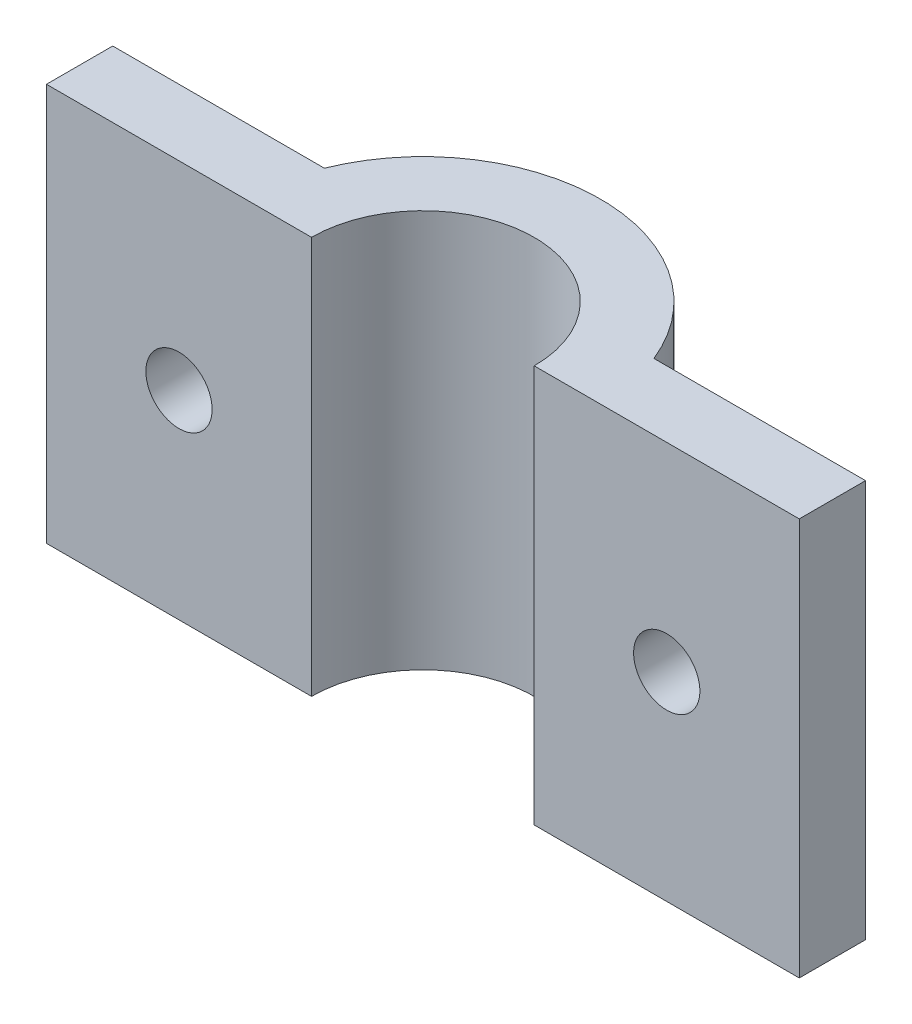
ISO-10303-21;
HEADER;
FILE_DESCRIPTION(('STEP AP214'),'2;1');
FILE_NAME('part.step','',(''),(''),'','','');
FILE_SCHEMA(('AUTOMOTIVE_DESIGN { 1 0 10303 214 1 1 1 1 }'));
ENDSEC;
DATA;
#1=APPLICATION_CONTEXT('core data for automotive mechanical design processes');
#2=APPLICATION_PROTOCOL_DEFINITION('international standard','automotive_design',2000,#1);
#3=PRODUCT_CONTEXT('',#1,'mechanical');
#4=PRODUCT('Part','Part','',(#3));
#5=PRODUCT_RELATED_PRODUCT_CATEGORY('part','',(#4));
#6=PRODUCT_DEFINITION_FORMATION('','',#4);
#7=PRODUCT_DEFINITION_CONTEXT('part definition',#1,'design');
#8=PRODUCT_DEFINITION('design','',#6,#7);
#9=PRODUCT_DEFINITION_SHAPE('','',#8);
#10=(LENGTH_UNIT() NAMED_UNIT(*) SI_UNIT(.MILLI.,.METRE.));
#11=(NAMED_UNIT(*) PLANE_ANGLE_UNIT() SI_UNIT($,.RADIAN.));
#12=(NAMED_UNIT(*) SI_UNIT($,.STERADIAN.) SOLID_ANGLE_UNIT());
#13=UNCERTAINTY_MEASURE_WITH_UNIT(LENGTH_MEASURE(1.E-05),#10,'distance_accuracy_value','');
#14=(GEOMETRIC_REPRESENTATION_CONTEXT(3) GLOBAL_UNCERTAINTY_ASSIGNED_CONTEXT((#13)) GLOBAL_UNIT_ASSIGNED_CONTEXT((#10,
#11,#12)) REPRESENTATION_CONTEXT('',''));
#15=CARTESIAN_POINT('',(0.,0.,0.));
#16=DIRECTION('',(0.,0.,1.));
#17=DIRECTION('',(1.,0.,0.));
#18=AXIS2_PLACEMENT_3D('',#15,#16,#17);
#19=CARTESIAN_POINT('',(10.668,38.1,0.));
#20=DIRECTION('',(0.,-1.,0.));
#21=DIRECTION('',(0.,0.,-1.));
#22=AXIS2_PLACEMENT_3D('',#19,#20,#21);
#23=CYLINDRICAL_SURFACE('',#22,10.668);
#24=CARTESIAN_POINT('',(10.668,0.,0.));
#25=DIRECTION('',(0.,-1.,0.));
#26=DIRECTION('',(0.,0.,-1.));
#27=AXIS2_PLACEMENT_3D('',#24,#25,#26);
#28=CIRCLE('',#27,10.668);
#29=CARTESIAN_POINT('',(0.,0.,0.));
#30=VERTEX_POINT('',#29);
#31=CARTESIAN_POINT('',(21.336,0.,0.));
#32=VERTEX_POINT('',#31);
#33=EDGE_CURVE('E143',#30,#32,#28,.T.);
#34=ORIENTED_EDGE('',*,*,#33,.T.);
#35=DIRECTION('',(0.,-1.,0.));
#36=VECTOR('',#35,1.);
#37=CARTESIAN_POINT('',(21.336,38.1,0.));
#38=LINE('',#37,#36);
#39=CARTESIAN_POINT('',(21.336,38.1,0.));
#40=VERTEX_POINT('',#39);
#41=EDGE_CURVE('E11',#40,#32,#38,.T.);
#42=ORIENTED_EDGE('',*,*,#41,.F.);
#43=CARTESIAN_POINT('',(10.668,38.1,0.));
#44=DIRECTION('',(0.,-1.,0.));
#45=DIRECTION('',(0.,0.,-1.));
#46=AXIS2_PLACEMENT_3D('',#43,#44,#45);
#47=CIRCLE('',#46,10.668);
#48=CARTESIAN_POINT('',(0.,38.1,0.));
#49=VERTEX_POINT('',#48);
#50=EDGE_CURVE('E165',#49,#40,#47,.T.);
#51=ORIENTED_EDGE('',*,*,#50,.F.);
#52=DIRECTION('',(0.,-1.,0.));
#53=VECTOR('',#52,1.);
#54=CARTESIAN_POINT('',(0.,38.1,0.));
#55=LINE('',#54,#53);
#56=EDGE_CURVE('E139',#49,#30,#55,.T.);
#57=ORIENTED_EDGE('',*,*,#56,.T.);
#58=EDGE_LOOP('',(#34,#42,#51,#57));
#59=FACE_BOUND('',#58,.T.);
#60=ADVANCED_FACE('F41',(#59),#23,.F.);
#61=CARTESIAN_POINT('',(21.336,38.1,0.));
#62=DIRECTION('',(0.,0.,-1.));
#63=DIRECTION('',(-1.,0.,0.));
#64=AXIS2_PLACEMENT_3D('',#61,#62,#63);
#65=PLANE('',#64);
#66=CARTESIAN_POINT('',(34.036,19.05,0.));
#67=DIRECTION('',(0.,0.,-1.));
#68=DIRECTION('',(-1.,0.,0.));
#69=AXIS2_PLACEMENT_3D('',#66,#67,#68);
#70=CIRCLE('',#69,3.175);
#71=CARTESIAN_POINT('',(30.861,19.05,0.));
#72=VERTEX_POINT('',#71);
#73=EDGE_CURVE('E214',#72,#72,#70,.T.);
#74=ORIENTED_EDGE('',*,*,#73,.T.);
#75=EDGE_LOOP('',(#74));
#76=FACE_BOUND('',#75,.T.);
#77=DIRECTION('',(1.,0.,0.));
#78=VECTOR('',#77,1.);
#79=CARTESIAN_POINT('',(21.336,0.,0.));
#80=LINE('',#79,#78);
#81=CARTESIAN_POINT('',(46.736,0.,0.));
#82=VERTEX_POINT('',#81);
#83=EDGE_CURVE('E147',#32,#82,#80,.T.);
#84=ORIENTED_EDGE('',*,*,#83,.T.);
#85=DIRECTION('',(0.,-1.,0.));
#86=VECTOR('',#85,1.);
#87=CARTESIAN_POINT('',(46.736,38.1,0.));
#88=LINE('',#87,#86);
#89=CARTESIAN_POINT('',(46.736,38.1,0.));
#90=VERTEX_POINT('',#89);
#91=EDGE_CURVE('E51',#90,#82,#88,.T.);
#92=ORIENTED_EDGE('',*,*,#91,.F.);
#93=DIRECTION('',(1.,0.,0.));
#94=VECTOR('',#93,1.);
#95=CARTESIAN_POINT('',(21.336,38.1,0.));
#96=LINE('',#95,#94);
#97=EDGE_CURVE('E102',#40,#90,#96,.T.);
#98=ORIENTED_EDGE('',*,*,#97,.F.);
#99=ORIENTED_EDGE('',*,*,#41,.T.);
#100=EDGE_LOOP('',(#84,#92,#98,#99));
#101=FACE_BOUND('',#100,.T.);
#102=ADVANCED_FACE('F223',(#76,#101),#65,.F.);
#103=CARTESIAN_POINT('',(46.736,38.1,-6.35));
#104=DIRECTION('',(-1.,0.,0.));
#105=DIRECTION('',(0.,0.,1.));
#106=AXIS2_PLACEMENT_3D('',#103,#104,#105);
#107=PLANE('',#106);
#108=DIRECTION('',(0.,0.,-1.));
#109=VECTOR('',#108,1.);
#110=CARTESIAN_POINT('',(46.736,0.,-6.35));
#111=LINE('',#110,#109);
#112=CARTESIAN_POINT('',(46.736,0.,-6.35));
#113=VERTEX_POINT('',#112);
#114=EDGE_CURVE('E150',#82,#113,#111,.T.);
#115=ORIENTED_EDGE('',*,*,#114,.T.);
#116=DIRECTION('',(0.,-1.,0.));
#117=VECTOR('',#116,1.);
#118=CARTESIAN_POINT('',(46.736,38.1,-6.35));
#119=LINE('',#118,#117);
#120=CARTESIAN_POINT('',(46.736,38.1,-6.35));
#121=VERTEX_POINT('',#120);
#122=EDGE_CURVE('E176',#121,#113,#119,.T.);
#123=ORIENTED_EDGE('',*,*,#122,.F.);
#124=DIRECTION('',(0.,0.,-1.));
#125=VECTOR('',#124,1.);
#126=CARTESIAN_POINT('',(46.736,38.1,-6.35));
#127=LINE('',#126,#125);
#128=EDGE_CURVE('E187',#90,#121,#127,.T.);
#129=ORIENTED_EDGE('',*,*,#128,.F.);
#130=ORIENTED_EDGE('',*,*,#91,.T.);
#131=EDGE_LOOP('',(#115,#123,#129,#130));
#132=FACE_BOUND('',#131,.T.);
#133=ADVANCED_FACE('F185',(#132),#107,.F.);
#134=CARTESIAN_POINT('',(26.4569145922068,38.1,-6.35));
#135=DIRECTION('',(0.,0.,1.));
#136=DIRECTION('',(1.,0.,0.));
#137=AXIS2_PLACEMENT_3D('',#134,#135,#136);
#138=PLANE('',#137);
#139=CARTESIAN_POINT('',(34.036,19.05,-6.35));
#140=DIRECTION('',(0.,0.,-1.));
#141=DIRECTION('',(-1.,0.,0.));
#142=AXIS2_PLACEMENT_3D('',#139,#140,#141);
#143=CIRCLE('',#142,3.175);
#144=CARTESIAN_POINT('',(30.861,19.05,-6.35));
#145=VERTEX_POINT('',#144);
#146=EDGE_CURVE('E215',#145,#145,#143,.T.);
#147=ORIENTED_EDGE('',*,*,#146,.F.);
#148=EDGE_LOOP('',(#147));
#149=FACE_BOUND('',#148,.T.);
#150=DIRECTION('',(-1.,0.,0.));
#151=VECTOR('',#150,1.);
#152=CARTESIAN_POINT('',(26.4569145922068,0.,-6.35));
#153=LINE('',#152,#151);
#154=CARTESIAN_POINT('',(26.4569145922068,0.,-6.35));
#155=VERTEX_POINT('',#154);
#156=EDGE_CURVE('E153',#113,#155,#153,.T.);
#157=ORIENTED_EDGE('',*,*,#156,.T.);
#158=DIRECTION('',(0.,-1.,0.));
#159=VECTOR('',#158,1.);
#160=CARTESIAN_POINT('',(26.4569145922068,38.1,-6.35));
#161=LINE('',#160,#159);
#162=CARTESIAN_POINT('',(26.4569145922068,38.1,-6.35));
#163=VERTEX_POINT('',#162);
#164=EDGE_CURVE('E172',#163,#155,#161,.T.);
#165=ORIENTED_EDGE('',*,*,#164,.F.);
#166=DIRECTION('',(-1.,0.,0.));
#167=VECTOR('',#166,1.);
#168=CARTESIAN_POINT('',(26.4569145922068,38.1,-6.35));
#169=LINE('',#168,#167);
#170=EDGE_CURVE('E200',#121,#163,#169,.T.);
#171=ORIENTED_EDGE('',*,*,#170,.F.);
#172=ORIENTED_EDGE('',*,*,#122,.T.);
#173=EDGE_LOOP('',(#157,#165,#171,#172));
#174=FACE_BOUND('',#173,.T.);
#175=ADVANCED_FACE('F195',(#149,#174),#138,.F.);
#176=CARTESIAN_POINT('',(10.668,38.1,0.));
#177=DIRECTION('',(0.,-1.,0.));
#178=DIRECTION('',(0.,0.,-1.));
#179=AXIS2_PLACEMENT_3D('',#176,#177,#178);
#180=CYLINDRICAL_SURFACE('',#179,17.018);
#181=CARTESIAN_POINT('',(10.668,0.,0.));
#182=DIRECTION('',(0.,1.,0.));
#183=DIRECTION('',(0.,0.,-1.));
#184=AXIS2_PLACEMENT_3D('',#181,#182,#183);
#185=CIRCLE('',#184,17.018);
#186=CARTESIAN_POINT('',(-5.12091459220677,0.,-6.35));
#187=VERTEX_POINT('',#186);
#188=EDGE_CURVE('E156',#155,#187,#185,.T.);
#189=ORIENTED_EDGE('',*,*,#188,.T.);
#190=DIRECTION('',(0.,-1.,0.));
#191=VECTOR('',#190,1.);
#192=CARTESIAN_POINT('',(-5.12091459220677,38.1,-6.35));
#193=LINE('',#192,#191);
#194=CARTESIAN_POINT('',(-5.12091459220677,38.1,-6.35));
#195=VERTEX_POINT('',#194);
#196=EDGE_CURVE('E132',#195,#187,#193,.T.);
#197=ORIENTED_EDGE('',*,*,#196,.F.);
#198=CARTESIAN_POINT('',(10.668,38.1,0.));
#199=DIRECTION('',(0.,1.,0.));
#200=DIRECTION('',(0.,0.,-1.));
#201=AXIS2_PLACEMENT_3D('',#198,#199,#200);
#202=CIRCLE('',#201,17.018);
#203=EDGE_CURVE('E121',#163,#195,#202,.T.);
#204=ORIENTED_EDGE('',*,*,#203,.F.);
#205=ORIENTED_EDGE('',*,*,#164,.T.);
#206=EDGE_LOOP('',(#189,#197,#204,#205));
#207=FACE_BOUND('',#206,.T.);
#208=ADVANCED_FACE('F198',(#207),#180,.T.);
#209=CARTESIAN_POINT('',(-5.12091459220677,38.1,-6.35));
#210=DIRECTION('',(0.,0.,1.));
#211=DIRECTION('',(1.,0.,0.));
#212=AXIS2_PLACEMENT_3D('',#209,#210,#211);
#213=PLANE('',#212);
#214=CARTESIAN_POINT('',(-12.7,19.05,-6.35));
#215=DIRECTION('',(0.,0.,-1.));
#216=DIRECTION('',(-1.,0.,0.));
#217=AXIS2_PLACEMENT_3D('',#214,#215,#216);
#218=CIRCLE('',#217,3.175);
#219=CARTESIAN_POINT('',(-15.875,19.05,-6.35));
#220=VERTEX_POINT('',#219);
#221=EDGE_CURVE('E210',#220,#220,#218,.T.);
#222=ORIENTED_EDGE('',*,*,#221,.F.);
#223=EDGE_LOOP('',(#222));
#224=FACE_BOUND('',#223,.T.);
#225=DIRECTION('',(-1.,0.,0.));
#226=VECTOR('',#225,1.);
#227=CARTESIAN_POINT('',(-5.12091459220677,0.,-6.35));
#228=LINE('',#227,#226);
#229=CARTESIAN_POINT('',(-25.4,0.,-6.35));
#230=VERTEX_POINT('',#229);
#231=EDGE_CURVE('E130',#187,#230,#228,.T.);
#232=ORIENTED_EDGE('',*,*,#231,.T.);
#233=DIRECTION('',(0.,-1.,0.));
#234=VECTOR('',#233,1.);
#235=CARTESIAN_POINT('',(-25.4,38.1,-6.35));
#236=LINE('',#235,#234);
#237=CARTESIAN_POINT('',(-25.4,38.1,-6.35));
#238=VERTEX_POINT('',#237);
#239=EDGE_CURVE('E127',#238,#230,#236,.T.);
#240=ORIENTED_EDGE('',*,*,#239,.F.);
#241=DIRECTION('',(-1.,0.,0.));
#242=VECTOR('',#241,1.);
#243=CARTESIAN_POINT('',(-5.12091459220677,38.1,-6.35));
#244=LINE('',#243,#242);
#245=EDGE_CURVE('E115',#195,#238,#244,.T.);
#246=ORIENTED_EDGE('',*,*,#245,.F.);
#247=ORIENTED_EDGE('',*,*,#196,.T.);
#248=EDGE_LOOP('',(#232,#240,#246,#247));
#249=FACE_BOUND('',#248,.T.);
#250=ADVANCED_FACE('F128',(#224,#249),#213,.F.);
#251=CARTESIAN_POINT('',(-25.4,38.1,-6.35));
#252=DIRECTION('',(1.,0.,0.));
#253=DIRECTION('',(0.,0.,-1.));
#254=AXIS2_PLACEMENT_3D('',#251,#252,#253);
#255=PLANE('',#254);
#256=DIRECTION('',(0.,0.,1.));
#257=VECTOR('',#256,1.);
#258=CARTESIAN_POINT('',(-25.4,0.,-6.35));
#259=LINE('',#258,#257);
#260=CARTESIAN_POINT('',(-25.4,0.,0.));
#261=VERTEX_POINT('',#260);
#262=EDGE_CURVE('E88',#230,#261,#259,.T.);
#263=ORIENTED_EDGE('',*,*,#262,.T.);
#264=DIRECTION('',(0.,-1.,0.));
#265=VECTOR('',#264,1.);
#266=CARTESIAN_POINT('',(-25.4,38.1,0.));
#267=LINE('',#266,#265);
#268=CARTESIAN_POINT('',(-25.4,38.1,0.));
#269=VERTEX_POINT('',#268);
#270=EDGE_CURVE('E133',#269,#261,#267,.T.);
#271=ORIENTED_EDGE('',*,*,#270,.F.);
#272=DIRECTION('',(0.,0.,1.));
#273=VECTOR('',#272,1.);
#274=CARTESIAN_POINT('',(-25.4,38.1,-6.35));
#275=LINE('',#274,#273);
#276=EDGE_CURVE('E119',#238,#269,#275,.T.);
#277=ORIENTED_EDGE('',*,*,#276,.F.);
#278=ORIENTED_EDGE('',*,*,#239,.T.);
#279=EDGE_LOOP('',(#263,#271,#277,#278));
#280=FACE_BOUND('',#279,.T.);
#281=ADVANCED_FACE('F135',(#280),#255,.F.);
#282=CARTESIAN_POINT('',(0.,38.1,0.));
#283=DIRECTION('',(0.,0.,-1.));
#284=DIRECTION('',(-1.,0.,0.));
#285=AXIS2_PLACEMENT_3D('',#282,#283,#284);
#286=PLANE('',#285);
#287=CARTESIAN_POINT('',(-12.7,19.05,0.));
#288=DIRECTION('',(0.,0.,-1.));
#289=DIRECTION('',(-1.,0.,0.));
#290=AXIS2_PLACEMENT_3D('',#287,#288,#289);
#291=CIRCLE('',#290,3.175);
#292=CARTESIAN_POINT('',(-15.875,19.05,0.));
#293=VERTEX_POINT('',#292);
#294=EDGE_CURVE('E44',#293,#293,#291,.T.);
#295=ORIENTED_EDGE('',*,*,#294,.T.);
#296=EDGE_LOOP('',(#295));
#297=FACE_BOUND('',#296,.T.);
#298=DIRECTION('',(1.,0.,0.));
#299=VECTOR('',#298,1.);
#300=CARTESIAN_POINT('',(0.,0.,0.));
#301=LINE('',#300,#299);
#302=EDGE_CURVE('E94',#261,#30,#301,.T.);
#303=ORIENTED_EDGE('',*,*,#302,.T.);
#304=ORIENTED_EDGE('',*,*,#56,.F.);
#305=DIRECTION('',(1.,0.,0.));
#306=VECTOR('',#305,1.);
#307=CARTESIAN_POINT('',(0.,38.1,0.));
#308=LINE('',#307,#306);
#309=EDGE_CURVE('E59',#269,#49,#308,.T.);
#310=ORIENTED_EDGE('',*,*,#309,.F.);
#311=ORIENTED_EDGE('',*,*,#270,.T.);
#312=EDGE_LOOP('',(#303,#304,#310,#311));
#313=FACE_BOUND('',#312,.T.);
#314=ADVANCED_FACE('F247',(#297,#313),#286,.F.);
#315=CARTESIAN_POINT('',(10.668,38.1,0.));
#316=DIRECTION('',(0.,-1.,0.));
#317=DIRECTION('',(0.,0.,-1.));
#318=AXIS2_PLACEMENT_3D('',#315,#316,#317);
#319=PLANE('',#318);
#320=ORIENTED_EDGE('',*,*,#50,.T.);
#321=ORIENTED_EDGE('',*,*,#97,.T.);
#322=ORIENTED_EDGE('',*,*,#128,.T.);
#323=ORIENTED_EDGE('',*,*,#170,.T.);
#324=ORIENTED_EDGE('',*,*,#203,.T.);
#325=ORIENTED_EDGE('',*,*,#245,.T.);
#326=ORIENTED_EDGE('',*,*,#276,.T.);
#327=ORIENTED_EDGE('',*,*,#309,.T.);
#328=EDGE_LOOP('',(#320,#321,#322,#323,#324,#325,#326,#327));
#329=FACE_BOUND('',#328,.T.);
#330=ADVANCED_FACE('F117',(#329),#319,.F.);
#331=CARTESIAN_POINT('',(10.668,0.,0.));
#332=DIRECTION('',(0.,-1.,0.));
#333=DIRECTION('',(0.,0.,-1.));
#334=AXIS2_PLACEMENT_3D('',#331,#332,#333);
#335=PLANE('',#334);
#336=ORIENTED_EDGE('',*,*,#33,.F.);
#337=ORIENTED_EDGE('',*,*,#302,.F.);
#338=ORIENTED_EDGE('',*,*,#262,.F.);
#339=ORIENTED_EDGE('',*,*,#231,.F.);
#340=ORIENTED_EDGE('',*,*,#188,.F.);
#341=ORIENTED_EDGE('',*,*,#156,.F.);
#342=ORIENTED_EDGE('',*,*,#114,.F.);
#343=ORIENTED_EDGE('',*,*,#83,.F.);
#344=EDGE_LOOP('',(#336,#337,#338,#339,#340,#341,#342,#343));
#345=FACE_BOUND('',#344,.T.);
#346=ADVANCED_FACE('F191',(#345),#335,.T.);
#347=CARTESIAN_POINT('',(-12.7,19.05,31.75));
#348=DIRECTION('',(0.,0.,-1.));
#349=DIRECTION('',(-1.,0.,0.));
#350=AXIS2_PLACEMENT_3D('',#347,#348,#349);
#351=CYLINDRICAL_SURFACE('',#350,3.175);
#352=CARTESIAN_POINT('',(-15.875,19.05,-6.35));
#353=CARTESIAN_POINT('',(-15.875,19.05,-6.28385416666667));
#354=CARTESIAN_POINT('',(-15.875,19.05,-6.21770833333333));
#355=CARTESIAN_POINT('',(-15.875,19.05,-6.08541666666667));
#356=CARTESIAN_POINT('',(-15.875,19.05,-6.01927083333334));
#357=CARTESIAN_POINT('',(-15.875,19.05,-5.88697916666667));
#358=CARTESIAN_POINT('',(-15.875,19.05,-5.82083333333333));
#359=CARTESIAN_POINT('',(-15.875,19.05,-5.68854166666667));
#360=CARTESIAN_POINT('',(-15.875,19.05,-5.62239583333333));
#361=CARTESIAN_POINT('',(-15.875,19.05,-5.49010416666667));
#362=CARTESIAN_POINT('',(-15.875,19.05,-5.42395833333333));
#363=CARTESIAN_POINT('',(-15.875,19.05,-5.29166666666667));
#364=CARTESIAN_POINT('',(-15.875,19.05,-5.22552083333333));
#365=CARTESIAN_POINT('',(-15.875,19.05,-5.09322916666667));
#366=CARTESIAN_POINT('',(-15.875,19.05,-5.02708333333333));
#367=CARTESIAN_POINT('',(-15.875,19.05,-4.89479166666666));
#368=CARTESIAN_POINT('',(-15.875,19.05,-4.82864583333333));
#369=CARTESIAN_POINT('',(-15.875,19.05,-4.69635416666666));
#370=CARTESIAN_POINT('',(-15.875,19.05,-4.63020833333333));
#371=CARTESIAN_POINT('',(-15.875,19.05,-4.49791666666667));
#372=CARTESIAN_POINT('',(-15.875,19.05,-4.43177083333333));
#373=CARTESIAN_POINT('',(-15.875,19.05,-4.29947916666666));
#374=CARTESIAN_POINT('',(-15.875,19.05,-4.23333333333333));
#375=CARTESIAN_POINT('',(-15.875,19.05,-4.10104166666666));
#376=CARTESIAN_POINT('',(-15.875,19.05,-4.03489583333333));
#377=CARTESIAN_POINT('',(-15.875,19.05,-3.90260416666667));
#378=CARTESIAN_POINT('',(-15.875,19.05,-3.83645833333333));
#379=CARTESIAN_POINT('',(-15.875,19.05,-3.70416666666666));
#380=CARTESIAN_POINT('',(-15.875,19.05,-3.63802083333333));
#381=CARTESIAN_POINT('',(-15.875,19.05,-3.50572916666666));
#382=CARTESIAN_POINT('',(-15.875,19.05,-3.43958333333333));
#383=CARTESIAN_POINT('',(-15.875,19.05,-3.30729166666667));
#384=CARTESIAN_POINT('',(-15.875,19.05,-3.24114583333333));
#385=CARTESIAN_POINT('',(-15.875,19.05,-3.10885416666666));
#386=CARTESIAN_POINT('',(-15.875,19.05,-3.04270833333333));
#387=CARTESIAN_POINT('',(-15.875,19.05,-2.91041666666666));
#388=CARTESIAN_POINT('',(-15.875,19.05,-2.84427083333333));
#389=CARTESIAN_POINT('',(-15.875,19.05,-2.71197916666667));
#390=CARTESIAN_POINT('',(-15.875,19.05,-2.64583333333333));
#391=CARTESIAN_POINT('',(-15.875,19.05,-2.51354166666666));
#392=CARTESIAN_POINT('',(-15.875,19.05,-2.44739583333333));
#393=CARTESIAN_POINT('',(-15.875,19.05,-2.31510416666666));
#394=CARTESIAN_POINT('',(-15.875,19.05,-2.24895833333333));
#395=CARTESIAN_POINT('',(-15.875,19.05,-2.11666666666666));
#396=CARTESIAN_POINT('',(-15.875,19.05,-2.05052083333333));
#397=CARTESIAN_POINT('',(-15.875,19.05,-1.91822916666666));
#398=CARTESIAN_POINT('',(-15.875,19.05,-1.85208333333333));
#399=CARTESIAN_POINT('',(-15.875,19.05,-1.71979166666666));
#400=CARTESIAN_POINT('',(-15.875,19.05,-1.65364583333333));
#401=CARTESIAN_POINT('',(-15.875,19.05,-1.52135416666666));
#402=CARTESIAN_POINT('',(-15.875,19.05,-1.45520833333333));
#403=CARTESIAN_POINT('',(-15.875,19.05,-1.32291666666666));
#404=CARTESIAN_POINT('',(-15.875,19.05,-1.25677083333333));
#405=CARTESIAN_POINT('',(-15.875,19.05,-1.12447916666666));
#406=CARTESIAN_POINT('',(-15.875,19.05,-1.05833333333333));
#407=CARTESIAN_POINT('',(-15.875,19.05,-0.926041666666664));
#408=CARTESIAN_POINT('',(-15.875,19.05,-0.85989583333333));
#409=CARTESIAN_POINT('',(-15.875,19.05,-0.727604166666662));
#410=CARTESIAN_POINT('',(-15.875,19.05,-0.661458333333328));
#411=CARTESIAN_POINT('',(-15.875,19.05,-0.529166666666659));
#412=CARTESIAN_POINT('',(-15.875,19.05,-0.463020833333325));
#413=CARTESIAN_POINT('',(-15.875,19.05,-0.330729166666659));
#414=CARTESIAN_POINT('',(-15.875,19.05,-0.264583333333327));
#415=CARTESIAN_POINT('',(-15.875,19.05,-0.132291666666661));
#416=CARTESIAN_POINT('',(-15.875,19.05,-0.0661458333333272));
#417=CARTESIAN_POINT('',(-15.875,19.05,0.));
#418=B_SPLINE_CURVE_WITH_KNOTS('',3,(#352,#353,#354,#355,#356,#357,#358,#359,#360,#361,#362,
#363,#364,#365,#366,#367,#368,#369,#370,#371,#372,#373,#374,#375,#376,#377,#378,#379,#380,#381,
#382,#383,#384,#385,#386,#387,#388,#389,#390,#391,#392,#393,#394,#395,#396,#397,#398,#399,#400,
#401,#402,#403,#404,#405,#406,#407,#408,#409,#410,#411,#412,#413,#414,#415,#416,#417),
.UNSPECIFIED.,.F.,.F.,(4,2,2,2,2,2,2,2,2,2,2,2,2,2,2,2,2,2,2,2,2,2,2,2,2,2,2,2,2,2,2,2,4),(0.,
0.198437500000002,0.396874999999998,0.5953125,0.793750000000003,0.992187499999998,1.190625,
1.3890625,1.58750000000001,1.7859375,1.984375,2.18281250000001,2.38125,2.5796875,
2.77812500000001,2.9765625,3.175,3.37343750000001,3.571875,3.7703125,3.96875000000001,4.1671875,
4.365625,4.56406250000001,4.7625,4.96093750000001,5.15937500000001,5.3578125,5.55625000000001,
5.75468750000001,5.95312500000001,6.15156250000001,6.35000000000001),.UNSPECIFIED.);
#419=EDGE_CURVE('BSEAM228',#220,#293,#418,.T.);
#420=ORIENTED_EDGE('',*,*,#221,.T.);
#421=ORIENTED_EDGE('',*,*,#294,.F.);
#422=ORIENTED_EDGE('',*,*,#419,.T.);
#423=ORIENTED_EDGE('',*,*,#419,.F.);
#424=EDGE_LOOP('',(#420,#422,#421,#423));
#425=FACE_BOUND('',#424,.T.);
#426=ADVANCED_FACE('F228',(#425),#351,.F.);
#427=CARTESIAN_POINT('',(34.036,19.05,0.));
#428=DIRECTION('',(0.,0.,-1.));
#429=DIRECTION('',(-1.,0.,0.));
#430=AXIS2_PLACEMENT_3D('',#427,#428,#429);
#431=CYLINDRICAL_SURFACE('',#430,3.175);
#432=ORIENTED_EDGE('',*,*,#73,.F.);
#433=EDGE_LOOP('',(#432));
#434=FACE_BOUND('',#433,.T.);
#435=ORIENTED_EDGE('',*,*,#146,.T.);
#436=EDGE_LOOP('',(#435));
#437=FACE_BOUND('',#436,.T.);
#438=ADVANCED_FACE('F225',(#434,#437),#431,.F.);
#439=CLOSED_SHELL('',(#60,#102,#133,#175,#208,#250,#281,#314,#330,#346,#426,#438));
#440=MANIFOLD_SOLID_BREP('B2',#439);
#441=ADVANCED_BREP_SHAPE_REPRESENTATION('',(#18,#440),#14);
#442=SHAPE_DEFINITION_REPRESENTATION(#9,#441);
ENDSEC;
END-ISO-10303-21;
